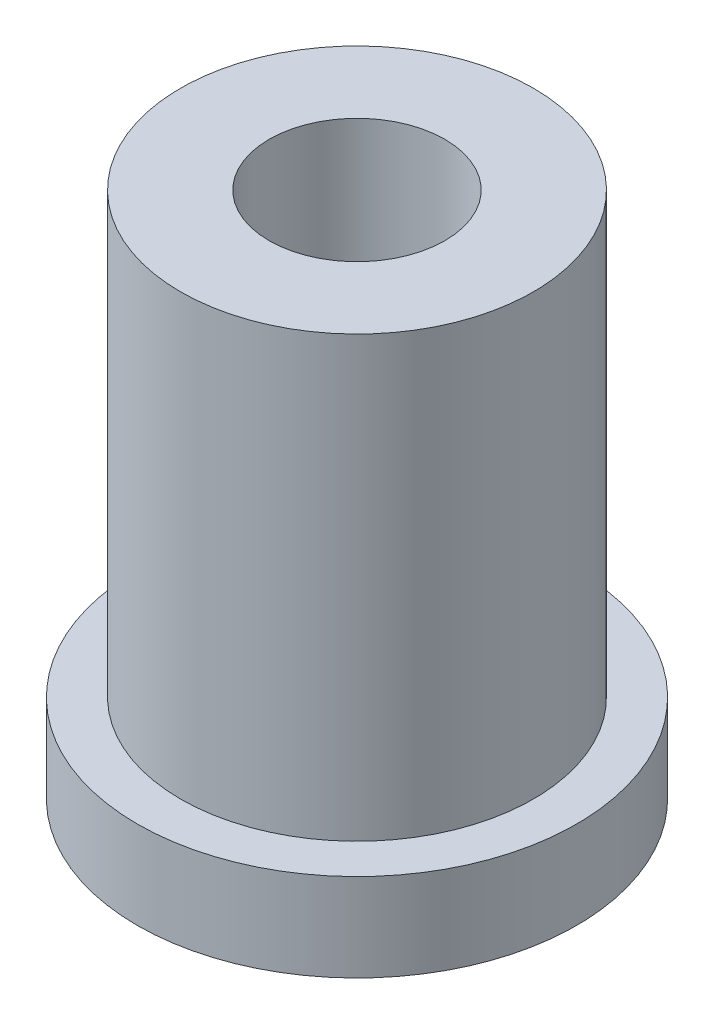
ISO-10303-21;
HEADER;
FILE_DESCRIPTION(('STEP AP214'),'2;1');
FILE_NAME('part.step','',(''),(''),'','','');
FILE_SCHEMA(('AUTOMOTIVE_DESIGN { 1 0 10303 214 1 1 1 1 }'));
ENDSEC;
DATA;
#1=APPLICATION_CONTEXT('core data for automotive mechanical design processes');
#2=APPLICATION_PROTOCOL_DEFINITION('international standard','automotive_design',2000,#1);
#3=PRODUCT_CONTEXT('',#1,'mechanical');
#4=PRODUCT('Part','Part','',(#3));
#5=PRODUCT_RELATED_PRODUCT_CATEGORY('part','',(#4));
#6=PRODUCT_DEFINITION_FORMATION('','',#4);
#7=PRODUCT_DEFINITION_CONTEXT('part definition',#1,'design');
#8=PRODUCT_DEFINITION('design','',#6,#7);
#9=PRODUCT_DEFINITION_SHAPE('','',#8);
#10=(LENGTH_UNIT() NAMED_UNIT(*) SI_UNIT(.MILLI.,.METRE.));
#11=(NAMED_UNIT(*) PLANE_ANGLE_UNIT() SI_UNIT($,.RADIAN.));
#12=(NAMED_UNIT(*) SI_UNIT($,.STERADIAN.) SOLID_ANGLE_UNIT());
#13=UNCERTAINTY_MEASURE_WITH_UNIT(LENGTH_MEASURE(1.E-05),#10,'distance_accuracy_value','');
#14=(GEOMETRIC_REPRESENTATION_CONTEXT(3) GLOBAL_UNCERTAINTY_ASSIGNED_CONTEXT((#13)) GLOBAL_UNIT_ASSIGNED_CONTEXT((#10,
#11,#12)) REPRESENTATION_CONTEXT('',''));
#15=CARTESIAN_POINT('',(0.,0.,0.));
#16=DIRECTION('',(0.,0.,1.));
#17=DIRECTION('',(1.,0.,0.));
#18=AXIS2_PLACEMENT_3D('',#15,#16,#17);
#19=CARTESIAN_POINT('',(0.,9.525,0.));
#20=DIRECTION('',(0.,1.,0.));
#21=DIRECTION('',(0.,0.,1.));
#22=AXIS2_PLACEMENT_3D('',#19,#20,#21);
#23=PLANE('',#22);
#24=CARTESIAN_POINT('',(0.,9.525,0.));
#25=DIRECTION('',(0.,1.,0.));
#26=DIRECTION('',(0.,0.,1.));
#27=AXIS2_PLACEMENT_3D('',#24,#25,#26);
#28=CIRCLE('',#27,3.1877);
#29=CARTESIAN_POINT('',(0.,9.525,-3.1877));
#30=VERTEX_POINT('',#29);
#31=EDGE_CURVE('E12',#30,#30,#28,.T.);
#32=ORIENTED_EDGE('',*,*,#31,.T.);
#33=EDGE_LOOP('',(#32));
#34=FACE_BOUND('',#33,.T.);
#35=CARTESIAN_POINT('',(0.,9.525,0.));
#36=DIRECTION('',(0.,1.,0.));
#37=DIRECTION('',(0.,0.,1.));
#38=AXIS2_PLACEMENT_3D('',#35,#36,#37);
#39=CIRCLE('',#38,1.5875);
#40=CARTESIAN_POINT('',(0.,9.525,-1.5875));
#41=VERTEX_POINT('',#40);
#42=EDGE_CURVE('E49',#41,#41,#39,.T.);
#43=ORIENTED_EDGE('',*,*,#42,.F.);
#44=EDGE_LOOP('',(#43));
#45=FACE_BOUND('',#44,.T.);
#46=ADVANCED_FACE('F42',(#34,#45),#23,.T.);
#47=CARTESIAN_POINT('',(0.,0.,0.));
#48=DIRECTION('',(0.,1.,0.));
#49=DIRECTION('',(0.,0.,1.));
#50=AXIS2_PLACEMENT_3D('',#47,#48,#49);
#51=PLANE('',#50);
#52=CARTESIAN_POINT('',(0.,0.,0.));
#53=DIRECTION('',(0.,1.,0.));
#54=DIRECTION('',(0.,0.,1.));
#55=AXIS2_PLACEMENT_3D('',#52,#53,#54);
#56=CIRCLE('',#55,1.5875);
#57=CARTESIAN_POINT('',(0.,0.,-1.5875));
#58=VERTEX_POINT('',#57);
#59=EDGE_CURVE('E53',#58,#58,#56,.T.);
#60=ORIENTED_EDGE('',*,*,#59,.T.);
#61=EDGE_LOOP('',(#60));
#62=FACE_BOUND('',#61,.T.);
#63=CARTESIAN_POINT('',(0.,0.,0.));
#64=DIRECTION('',(0.,1.,0.));
#65=DIRECTION('',(0.,0.,1.));
#66=AXIS2_PLACEMENT_3D('',#63,#64,#65);
#67=CIRCLE('',#66,3.96875);
#68=CARTESIAN_POINT('',(0.,0.,3.96875));
#69=VERTEX_POINT('',#68);
#70=EDGE_CURVE('E60',#69,#69,#67,.T.);
#71=ORIENTED_EDGE('',*,*,#70,.F.);
#72=EDGE_LOOP('',(#71));
#73=FACE_BOUND('',#72,.T.);
#74=ADVANCED_FACE('F85',(#62,#73),#51,.F.);
#75=CARTESIAN_POINT('',(0.,9.525,0.));
#76=DIRECTION('',(0.,-1.,0.));
#77=DIRECTION('',(0.,0.,-1.));
#78=AXIS2_PLACEMENT_3D('',#75,#76,#77);
#79=CYLINDRICAL_SURFACE('',#78,3.1877);
#80=CARTESIAN_POINT('',(0.,1.5875,0.));
#81=DIRECTION('',(0.,1.,0.));
#82=DIRECTION('',(0.,0.,1.));
#83=AXIS2_PLACEMENT_3D('',#80,#81,#82);
#84=CIRCLE('',#83,3.1877);
#85=CARTESIAN_POINT('',(0.,1.5875,-3.1877));
#86=VERTEX_POINT('',#85);
#87=EDGE_CURVE('E63',#86,#86,#84,.T.);
#88=CARTESIAN_POINT('',(0.,1.5875,-3.1877));
#89=CARTESIAN_POINT('',(0.,1.67018229166667,-3.1877));
#90=CARTESIAN_POINT('',(0.,1.75286458333333,-3.1877));
#91=CARTESIAN_POINT('',(0.,1.91822916666666,-3.1877));
#92=CARTESIAN_POINT('',(0.,2.00091145833333,-3.1877));
#93=CARTESIAN_POINT('',(0.,2.16627604166666,-3.1877));
#94=CARTESIAN_POINT('',(0.,2.24895833333333,-3.1877));
#95=CARTESIAN_POINT('',(0.,2.41432291666667,-3.1877));
#96=CARTESIAN_POINT('',(0.,2.49700520833333,-3.1877));
#97=CARTESIAN_POINT('',(0.,2.66236979166666,-3.1877));
#98=CARTESIAN_POINT('',(0.,2.74505208333333,-3.1877));
#99=CARTESIAN_POINT('',(0.,2.91041666666667,-3.1877));
#100=CARTESIAN_POINT('',(0.,2.99309895833333,-3.1877));
#101=CARTESIAN_POINT('',(0.,3.15846354166667,-3.1877));
#102=CARTESIAN_POINT('',(0.,3.24114583333333,-3.1877));
#103=CARTESIAN_POINT('',(0.,3.40651041666667,-3.1877));
#104=CARTESIAN_POINT('',(0.,3.48919270833333,-3.1877));
#105=CARTESIAN_POINT('',(0.,3.65455729166666,-3.1877));
#106=CARTESIAN_POINT('',(0.,3.73723958333333,-3.1877));
#107=CARTESIAN_POINT('',(0.,3.90260416666667,-3.1877));
#108=CARTESIAN_POINT('',(0.,3.98528645833333,-3.1877));
#109=CARTESIAN_POINT('',(0.,4.15065104166666,-3.1877));
#110=CARTESIAN_POINT('',(0.,4.23333333333333,-3.1877));
#111=CARTESIAN_POINT('',(0.,4.39869791666667,-3.1877));
#112=CARTESIAN_POINT('',(0.,4.48138020833333,-3.1877));
#113=CARTESIAN_POINT('',(0.,4.64674479166667,-3.1877));
#114=CARTESIAN_POINT('',(0.,4.72942708333333,-3.1877));
#115=CARTESIAN_POINT('',(0.,4.89479166666667,-3.1877));
#116=CARTESIAN_POINT('',(0.,4.97747395833333,-3.1877));
#117=CARTESIAN_POINT('',(0.,5.14283854166666,-3.1877));
#118=CARTESIAN_POINT('',(0.,5.22552083333333,-3.1877));
#119=CARTESIAN_POINT('',(0.,5.39088541666667,-3.1877));
#120=CARTESIAN_POINT('',(0.,5.47356770833333,-3.1877));
#121=CARTESIAN_POINT('',(0.,5.63893229166666,-3.1877));
#122=CARTESIAN_POINT('',(0.,5.72161458333333,-3.1877));
#123=CARTESIAN_POINT('',(0.,5.88697916666666,-3.1877));
#124=CARTESIAN_POINT('',(0.,5.96966145833333,-3.1877));
#125=CARTESIAN_POINT('',(0.,6.13502604166666,-3.1877));
#126=CARTESIAN_POINT('',(0.,6.21770833333333,-3.1877));
#127=CARTESIAN_POINT('',(0.,6.38307291666667,-3.1877));
#128=CARTESIAN_POINT('',(0.,6.46575520833333,-3.1877));
#129=CARTESIAN_POINT('',(0.,6.63111979166666,-3.1877));
#130=CARTESIAN_POINT('',(0.,6.71380208333333,-3.1877));
#131=CARTESIAN_POINT('',(0.,6.87916666666666,-3.1877));
#132=CARTESIAN_POINT('',(0.,6.96184895833333,-3.1877));
#133=CARTESIAN_POINT('',(0.,7.12721354166666,-3.1877));
#134=CARTESIAN_POINT('',(0.,7.20989583333333,-3.1877));
#135=CARTESIAN_POINT('',(0.,7.37526041666667,-3.1877));
#136=CARTESIAN_POINT('',(0.,7.45794270833333,-3.1877));
#137=CARTESIAN_POINT('',(0.,7.62330729166666,-3.1877));
#138=CARTESIAN_POINT('',(0.,7.70598958333333,-3.1877));
#139=CARTESIAN_POINT('',(0.,7.87135416666667,-3.1877));
#140=CARTESIAN_POINT('',(0.,7.95403645833333,-3.1877));
#141=CARTESIAN_POINT('',(0.,8.11940104166667,-3.1877));
#142=CARTESIAN_POINT('',(0.,8.20208333333333,-3.1877));
#143=CARTESIAN_POINT('',(0.,8.36744791666667,-3.1877));
#144=CARTESIAN_POINT('',(0.,8.45013020833333,-3.1877));
#145=CARTESIAN_POINT('',(0.,8.61549479166667,-3.1877));
#146=CARTESIAN_POINT('',(0.,8.69817708333333,-3.1877));
#147=CARTESIAN_POINT('',(0.,8.86354166666666,-3.1877));
#148=CARTESIAN_POINT('',(0.,8.94622395833333,-3.1877));
#149=CARTESIAN_POINT('',(0.,9.11158854166667,-3.1877));
#150=CARTESIAN_POINT('',(0.,9.19427083333333,-3.1877));
#151=CARTESIAN_POINT('',(0.,9.35963541666667,-3.1877));
#152=CARTESIAN_POINT('',(0.,9.44231770833333,-3.1877));
#153=CARTESIAN_POINT('',(0.,9.525,-3.1877));
#154=B_SPLINE_CURVE_WITH_KNOTS('',3,(#88,#89,#90,#91,#92,#93,#94,#95,#96,#97,#98,#99,#100,#101,
#102,#103,#104,#105,#106,#107,#108,#109,#110,#111,#112,#113,#114,#115,#116,#117,#118,#119,#120,
#121,#122,#123,#124,#125,#126,#127,#128,#129,#130,#131,#132,#133,#134,#135,#136,#137,#138,#139,
#140,#141,#142,#143,#144,#145,#146,#147,#148,#149,#150,#151,#152,#153),.UNSPECIFIED.,.F.,.F.,(4,
2,2,2,2,2,2,2,2,2,2,2,2,2,2,2,2,2,2,2,2,2,2,2,2,2,2,2,2,2,2,2,4),(0.,0.248046875,
0.496093749999999,0.744140625,0.992187499999999,1.240234375,1.48828125,1.736328125,1.984375,
2.232421875,2.48046875,2.728515625,2.9765625,3.224609375,3.47265625,3.720703125,3.96875,
4.216796875,4.46484375,4.712890625,4.9609375,5.208984375,5.45703125,5.705078125,5.953125,
6.201171875,6.44921875,6.697265625,6.9453125,7.193359375,7.44140625,7.689453125,7.9375),.UNSPECIFIED.);
#155=EDGE_CURVE('BSEAM44',#86,#30,#154,.T.);
#156=ORIENTED_EDGE('',*,*,#87,.T.);
#157=ORIENTED_EDGE('',*,*,#31,.F.);
#158=ORIENTED_EDGE('',*,*,#155,.T.);
#159=ORIENTED_EDGE('',*,*,#155,.F.);
#160=EDGE_LOOP('',(#156,#158,#157,#159));
#161=FACE_BOUND('',#160,.T.);
#162=ADVANCED_FACE('F44',(#161),#79,.T.);
#163=CARTESIAN_POINT('',(0.,9.525,0.));
#164=DIRECTION('',(0.,-1.,0.));
#165=DIRECTION('',(0.,0.,-1.));
#166=AXIS2_PLACEMENT_3D('',#163,#164,#165);
#167=CYLINDRICAL_SURFACE('',#166,1.5875);
#168=CARTESIAN_POINT('',(0.,9.525,-1.5875));
#169=CARTESIAN_POINT('',(0.,9.42578125,-1.5875));
#170=CARTESIAN_POINT('',(0.,9.3265625,-1.5875));
#171=CARTESIAN_POINT('',(0.,9.128125,-1.5875));
#172=CARTESIAN_POINT('',(0.,9.02890625,-1.5875));
#173=CARTESIAN_POINT('',(0.,8.83046875,-1.5875));
#174=CARTESIAN_POINT('',(0.,8.73125,-1.5875));
#175=CARTESIAN_POINT('',(0.,8.5328125,-1.5875));
#176=CARTESIAN_POINT('',(0.,8.43359375,-1.5875));
#177=CARTESIAN_POINT('',(0.,8.23515625,-1.5875));
#178=CARTESIAN_POINT('',(0.,8.1359375,-1.5875));
#179=CARTESIAN_POINT('',(0.,7.9375,-1.5875));
#180=CARTESIAN_POINT('',(0.,7.83828125,-1.5875));
#181=CARTESIAN_POINT('',(0.,7.63984375,-1.5875));
#182=CARTESIAN_POINT('',(0.,7.540625,-1.5875));
#183=CARTESIAN_POINT('',(0.,7.3421875,-1.5875));
#184=CARTESIAN_POINT('',(0.,7.24296875,-1.5875));
#185=CARTESIAN_POINT('',(0.,7.04453125,-1.5875));
#186=CARTESIAN_POINT('',(0.,6.9453125,-1.5875));
#187=CARTESIAN_POINT('',(0.,6.746875,-1.5875));
#188=CARTESIAN_POINT('',(0.,6.64765625,-1.5875));
#189=CARTESIAN_POINT('',(0.,6.44921875,-1.5875));
#190=CARTESIAN_POINT('',(0.,6.35,-1.5875));
#191=CARTESIAN_POINT('',(0.,6.1515625,-1.5875));
#192=CARTESIAN_POINT('',(0.,6.05234375,-1.5875));
#193=CARTESIAN_POINT('',(0.,5.85390625,-1.5875));
#194=CARTESIAN_POINT('',(0.,5.7546875,-1.5875));
#195=CARTESIAN_POINT('',(0.,5.55625,-1.5875));
#196=CARTESIAN_POINT('',(0.,5.45703125,-1.5875));
#197=CARTESIAN_POINT('',(0.,5.25859375,-1.5875));
#198=CARTESIAN_POINT('',(0.,5.159375,-1.5875));
#199=CARTESIAN_POINT('',(0.,4.9609375,-1.5875));
#200=CARTESIAN_POINT('',(0.,4.86171875,-1.5875));
#201=CARTESIAN_POINT('',(0.,4.66328125,-1.5875));
#202=CARTESIAN_POINT('',(0.,4.5640625,-1.5875));
#203=CARTESIAN_POINT('',(0.,4.365625,-1.5875));
#204=CARTESIAN_POINT('',(0.,4.26640625,-1.5875));
#205=CARTESIAN_POINT('',(0.,4.06796875,-1.5875));
#206=CARTESIAN_POINT('',(0.,3.96875,-1.5875));
#207=CARTESIAN_POINT('',(0.,3.7703125,-1.5875));
#208=CARTESIAN_POINT('',(0.,3.67109375,-1.5875));
#209=CARTESIAN_POINT('',(0.,3.47265625,-1.5875));
#210=CARTESIAN_POINT('',(0.,3.3734375,-1.5875));
#211=CARTESIAN_POINT('',(0.,3.175,-1.5875));
#212=CARTESIAN_POINT('',(0.,3.07578125,-1.5875));
#213=CARTESIAN_POINT('',(0.,2.87734375,-1.5875));
#214=CARTESIAN_POINT('',(0.,2.778125,-1.5875));
#215=CARTESIAN_POINT('',(0.,2.5796875,-1.5875));
#216=CARTESIAN_POINT('',(0.,2.48046875,-1.5875));
#217=CARTESIAN_POINT('',(0.,2.28203125,-1.5875));
#218=CARTESIAN_POINT('',(0.,2.1828125,-1.5875));
#219=CARTESIAN_POINT('',(0.,1.984375,-1.5875));
#220=CARTESIAN_POINT('',(0.,1.88515625,-1.5875));
#221=CARTESIAN_POINT('',(0.,1.68671875,-1.5875));
#222=CARTESIAN_POINT('',(0.,1.5875,-1.5875));
#223=CARTESIAN_POINT('',(0.,1.3890625,-1.5875));
#224=CARTESIAN_POINT('',(0.,1.28984375,-1.5875));
#225=CARTESIAN_POINT('',(0.,1.09140625,-1.5875));
#226=CARTESIAN_POINT('',(0.,0.992187500000001,-1.5875));
#227=CARTESIAN_POINT('',(0.,0.793750000000001,-1.5875));
#228=CARTESIAN_POINT('',(0.,0.69453125,-1.5875));
#229=CARTESIAN_POINT('',(0.,0.49609375,-1.5875));
#230=CARTESIAN_POINT('',(0.,0.396875,-1.5875));
#231=CARTESIAN_POINT('',(0.,0.1984375,-1.5875));
#232=CARTESIAN_POINT('',(0.,0.0992187500000001,-1.5875));
#233=CARTESIAN_POINT('',(0.,0.,-1.5875));
#234=B_SPLINE_CURVE_WITH_KNOTS('',3,(#168,#169,#170,#171,#172,#173,#174,#175,#176,#177,#178,
#179,#180,#181,#182,#183,#184,#185,#186,#187,#188,#189,#190,#191,#192,#193,#194,#195,#196,#197,
#198,#199,#200,#201,#202,#203,#204,#205,#206,#207,#208,#209,#210,#211,#212,#213,#214,#215,#216,
#217,#218,#219,#220,#221,#222,#223,#224,#225,#226,#227,#228,#229,#230,#231,#232,#233),
.UNSPECIFIED.,.F.,.F.,(4,2,2,2,2,2,2,2,2,2,2,2,2,2,2,2,2,2,2,2,2,2,2,2,2,2,2,2,2,2,2,2,4),(0.,
0.297656249999998,0.595312499999999,0.892968749999999,1.190625,1.48828125,1.7859375,2.08359375,
2.38125,2.67890625,2.9765625,3.27421875,3.571875,3.86953125,4.1671875,4.46484375,4.7625,
5.06015625,5.3578125,5.65546875,5.953125,6.25078125,6.5484375,6.84609375,7.14375,7.44140625,
7.7390625,8.03671875,8.334375,8.63203125,8.9296875,9.22734375,9.525),.UNSPECIFIED.);
#235=EDGE_CURVE('BSEAM74',#41,#58,#234,.T.);
#236=ORIENTED_EDGE('',*,*,#42,.T.);
#237=ORIENTED_EDGE('',*,*,#59,.F.);
#238=ORIENTED_EDGE('',*,*,#235,.T.);
#239=ORIENTED_EDGE('',*,*,#235,.F.);
#240=EDGE_LOOP('',(#236,#238,#237,#239));
#241=FACE_BOUND('',#240,.T.);
#242=ADVANCED_FACE('F74',(#241),#167,.F.);
#243=CARTESIAN_POINT('',(0.,1.5875,0.));
#244=DIRECTION('',(0.,1.,0.));
#245=DIRECTION('',(0.,0.,1.));
#246=AXIS2_PLACEMENT_3D('',#243,#244,#245);
#247=PLANE('',#246);
#248=CARTESIAN_POINT('',(0.,1.5875,0.));
#249=DIRECTION('',(0.,1.,0.));
#250=DIRECTION('',(0.,0.,1.));
#251=AXIS2_PLACEMENT_3D('',#248,#249,#250);
#252=CIRCLE('',#251,3.96875);
#253=CARTESIAN_POINT('',(0.,1.5875,3.96875));
#254=VERTEX_POINT('',#253);
#255=EDGE_CURVE('E58',#254,#254,#252,.T.);
#256=ORIENTED_EDGE('',*,*,#255,.T.);
#257=EDGE_LOOP('',(#256));
#258=FACE_BOUND('',#257,.T.);
#259=ORIENTED_EDGE('',*,*,#87,.F.);
#260=EDGE_LOOP('',(#259));
#261=FACE_BOUND('',#260,.T.);
#262=ADVANCED_FACE('F71',(#258,#261),#247,.T.);
#263=CARTESIAN_POINT('',(0.,1.5875,0.));
#264=DIRECTION('',(0.,-1.,0.));
#265=DIRECTION('',(0.,0.,-1.));
#266=AXIS2_PLACEMENT_3D('',#263,#264,#265);
#267=CYLINDRICAL_SURFACE('',#266,3.96875);
#268=ORIENTED_EDGE('',*,*,#255,.F.);
#269=EDGE_LOOP('',(#268));
#270=FACE_BOUND('',#269,.T.);
#271=ORIENTED_EDGE('',*,*,#70,.T.);
#272=EDGE_LOOP('',(#271));
#273=FACE_BOUND('',#272,.T.);
#274=ADVANCED_FACE('F73',(#270,#273),#267,.T.);
#275=CLOSED_SHELL('',(#46,#74,#162,#242,#262,#274));
#276=MANIFOLD_SOLID_BREP('B2',#275);
#277=ADVANCED_BREP_SHAPE_REPRESENTATION('',(#18,#276),#14);
#278=SHAPE_DEFINITION_REPRESENTATION(#9,#277);
ENDSEC;
END-ISO-10303-21;
